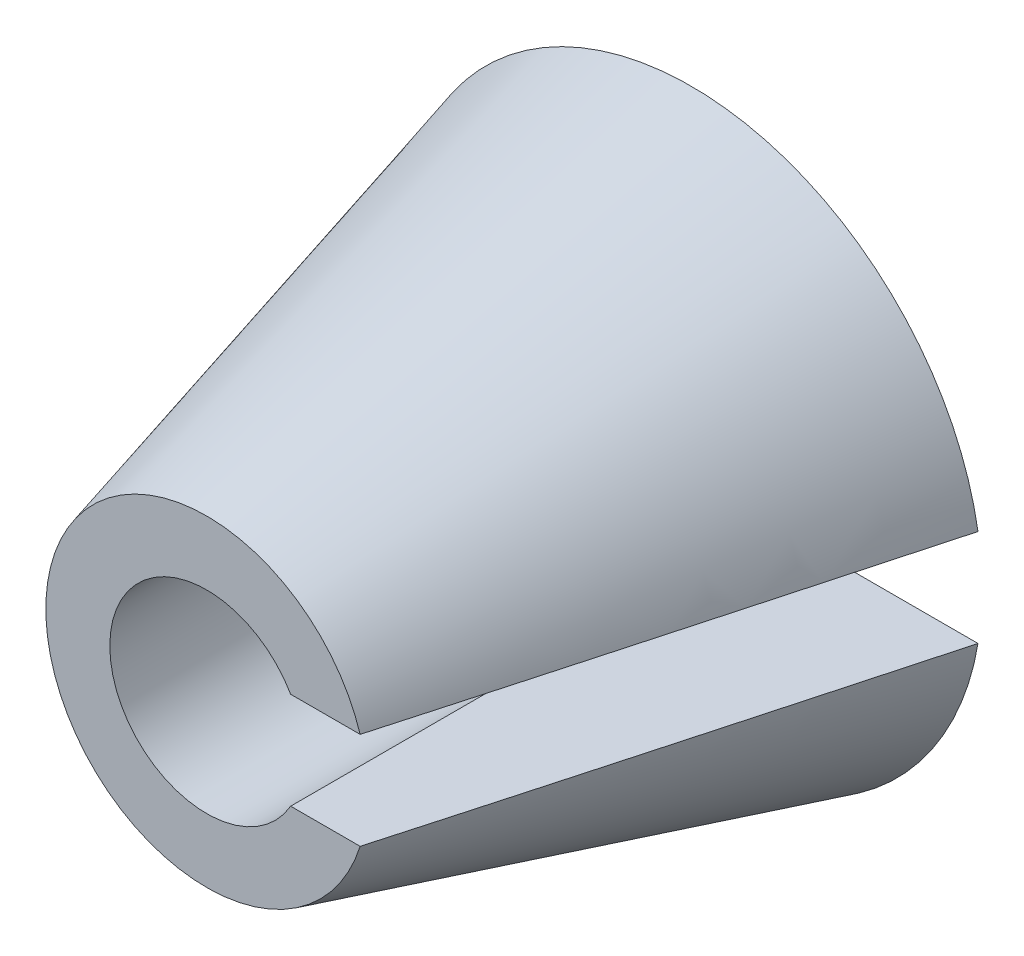
ISO-10303-21;
HEADER;
FILE_DESCRIPTION(('STEP AP214'),'2;1');
FILE_NAME('part.step','',(''),(''),'','','');
FILE_SCHEMA(('AUTOMOTIVE_DESIGN { 1 0 10303 214 1 1 1 1 }'));
ENDSEC;
DATA;
#1=APPLICATION_CONTEXT('core data for automotive mechanical design processes');
#2=APPLICATION_PROTOCOL_DEFINITION('international standard','automotive_design',2000,#1);
#3=PRODUCT_CONTEXT('',#1,'mechanical');
#4=PRODUCT('Part','Part','',(#3));
#5=PRODUCT_RELATED_PRODUCT_CATEGORY('part','',(#4));
#6=PRODUCT_DEFINITION_FORMATION('','',#4);
#7=PRODUCT_DEFINITION_CONTEXT('part definition',#1,'design');
#8=PRODUCT_DEFINITION('design','',#6,#7);
#9=PRODUCT_DEFINITION_SHAPE('','',#8);
#10=(LENGTH_UNIT() NAMED_UNIT(*) SI_UNIT(.MILLI.,.METRE.));
#11=(NAMED_UNIT(*) PLANE_ANGLE_UNIT() SI_UNIT($,.RADIAN.));
#12=(NAMED_UNIT(*) SI_UNIT($,.STERADIAN.) SOLID_ANGLE_UNIT());
#13=UNCERTAINTY_MEASURE_WITH_UNIT(LENGTH_MEASURE(1.E-05),#10,'distance_accuracy_value','');
#14=(GEOMETRIC_REPRESENTATION_CONTEXT(3) GLOBAL_UNCERTAINTY_ASSIGNED_CONTEXT((#13)) GLOBAL_UNIT_ASSIGNED_CONTEXT((#10,
#11,#12)) REPRESENTATION_CONTEXT('',''));
#15=CARTESIAN_POINT('',(0.,0.,0.));
#16=DIRECTION('',(0.,0.,1.));
#17=DIRECTION('',(1.,0.,0.));
#18=AXIS2_PLACEMENT_3D('',#15,#16,#17);
#19=CARTESIAN_POINT('',(0.,0.,0.));
#20=DIRECTION('',(0.,0.,-1.));
#21=DIRECTION('',(1.,0.,0.));
#22=AXIS2_PLACEMENT_3D('',#19,#20,#21);
#23=CONICAL_SURFACE('',#22,6.,0.26179938779915);
#24=CARTESIAN_POINT('',(0.,0.,0.));
#25=DIRECTION('',(0.,0.,1.));
#26=DIRECTION('',(1.,0.,0.));
#27=AXIS2_PLACEMENT_3D('',#24,#25,#26);
#28=CIRCLE('',#27,6.);
#29=CARTESIAN_POINT('',(5.91607978309962,1.,0.));
#30=VERTEX_POINT('',#29);
#31=CARTESIAN_POINT('',(5.91607978309962,-1.,0.));
#32=VERTEX_POINT('',#31);
#33=EDGE_CURVE('E53',#30,#32,#28,.T.);
#34=ORIENTED_EDGE('',*,*,#33,.T.);
#35=CARTESIAN_POINT('',(7.86764606829933,-1.,-7.20637686178306));
#36=CARTESIAN_POINT('',(7.67358093257711,-1.,-6.48791083582461));
#37=CARTESIAN_POINT('',(7.47941639547781,-1.,-5.76947163006494));
#38=CARTESIAN_POINT('',(7.09081762951427,-1.,-4.33266595765343));
#39=CARTESIAN_POINT('',(6.89638340057781,-1.,-3.61429949102113));
#40=CARTESIAN_POINT('',(6.50715802870426,-1.,-2.17759810812691));
#41=CARTESIAN_POINT('',(6.31236685700782,-1.,-1.45926319965485));
#42=CARTESIAN_POINT('',(5.92233632049141,-1.,-0.0227151247883951));
#43=CARTESIAN_POINT('',(5.72709695572005,-1.,0.695498041619203));
#44=CARTESIAN_POINT('',(5.33601456692654,-1.,2.1317577858784));
#45=CARTESIAN_POINT('',(5.14017154468255,-1.,2.84980436421403));
#46=CARTESIAN_POINT('',(4.74764366484651,-1.,4.28566487028006));
#47=CARTESIAN_POINT('',(4.55095881014779,-1.,5.00347879880097));
#48=CARTESIAN_POINT('',(4.15637387698971,-1.,6.43872026453747));
#49=CARTESIAN_POINT('',(3.95847388216664,-1.,7.1561478247298));
#50=CARTESIAN_POINT('',(3.56078842273446,-1.,8.59049100513599));
#51=CARTESIAN_POINT('',(3.36100293406612,-1.,9.30740661869142));
#52=CARTESIAN_POINT('',(3.01468771049255,-1.,10.5396341877083));
#53=CARTESIAN_POINT('',(2.8689182520442,-1.,11.0551593036322));
#54=CARTESIAN_POINT('',(2.64833036507019,-1.,11.8278851288014));
#55=CARTESIAN_POINT('',(2.57448014712804,-1.,12.0853620839691));
#56=CARTESIAN_POINT('',(2.42594190552158,-1.,12.6000764672381));
#57=CARTESIAN_POINT('',(2.35125387603948,-1.,12.8573138936627));
#58=CARTESIAN_POINT('',(2.20076526105176,-1.,13.3715038189127));
#59=CARTESIAN_POINT('',(2.12496451621292,-1.,13.6284562711525));
#60=CARTESIAN_POINT('',(1.97186908296628,-1.,14.1419120253778));
#61=CARTESIAN_POINT('',(1.89457442305106,-1.,14.3984153358279));
#62=CARTESIAN_POINT('',(1.77702758152167,-1.,14.7826969356929));
#63=CARTESIAN_POINT('',(1.73757533080256,-1.,14.9107198279955));
#64=CARTESIAN_POINT('',(1.65801556674422,-1.,15.1665611090953));
#65=CARTESIAN_POINT('',(1.61790805773787,-1.,15.2943794992387));
#66=CARTESIAN_POINT('',(1.53688635332859,-1.,15.5497700817268));
#67=CARTESIAN_POINT('',(1.49597210649291,-1.,15.6773422578014));
#68=CARTESIAN_POINT('',(1.41310771731348,-1.,15.9321525965593));
#69=CARTESIAN_POINT('',(1.37115755139541,-1.,16.0593907515683));
#70=CARTESIAN_POINT('',(1.328574501345,-1.,16.1864191795279));
#71=B_SPLINE_CURVE_WITH_KNOTS('',3,(#35,#36,#37,#38,#39,#40,#41,#42,#43,#44,#45,#46,#47,#48,#49,
#50,#51,#52,#53,#54,#55,#56,#57,#58,#59,#60,#61,#62,#63,#64,#65,#66,#67,#68,#69,#70),
.UNSPECIFIED.,.F.,.F.,(4,2,2,2,2,2,2,2,2,2,2,2,2,2,2,2,2,4),(0.,2.23264249788737,
4.46528559390912,6.69811726857511,8.93094870103296,11.1637735626191,13.3965907562199,
15.6292559535571,17.8619496787128,19.4691577917994,20.2727326145734,21.0763130208558,
21.8800096390667,22.6836909439268,23.0855814165112,23.4874692326833,23.889382754182,
24.2913054304328),.UNSPECIFIED.);
#72=CARTESIAN_POINT('',(3.16635024605844,-1.,10.));
#73=VERTEX_POINT('',#72);
#74=EDGE_CURVE('E105',#32,#73,#71,.T.);
#75=ORIENTED_EDGE('',*,*,#74,.T.);
#76=CARTESIAN_POINT('',(0.,0.,10.));
#77=DIRECTION('',(0.,0.,1.));
#78=DIRECTION('',(1.,0.,0.));
#79=AXIS2_PLACEMENT_3D('',#76,#77,#78);
#80=CIRCLE('',#79,3.32050807568877);
#81=CARTESIAN_POINT('',(3.16635024605844,1.,10.));
#82=VERTEX_POINT('',#81);
#83=EDGE_CURVE('E13',#82,#73,#80,.T.);
#84=ORIENTED_EDGE('',*,*,#83,.F.);
#85=CARTESIAN_POINT('',(7.86764606829933,1.,-7.20637686178306));
#86=CARTESIAN_POINT('',(7.67358093257711,1.,-6.48791083582461));
#87=CARTESIAN_POINT('',(7.47941639547781,1.,-5.76947163006494));
#88=CARTESIAN_POINT('',(7.09081762951427,1.,-4.33266595765343));
#89=CARTESIAN_POINT('',(6.89638340057781,1.,-3.61429949102113));
#90=CARTESIAN_POINT('',(6.50715802870426,1.,-2.17759810812691));
#91=CARTESIAN_POINT('',(6.31236685700782,1.,-1.45926319965485));
#92=CARTESIAN_POINT('',(5.92233632049141,1.,-0.0227151247883951));
#93=CARTESIAN_POINT('',(5.72709695572005,1.,0.695498041619203));
#94=CARTESIAN_POINT('',(5.33601456692654,1.,2.1317577858784));
#95=CARTESIAN_POINT('',(5.14017154468255,1.,2.84980436421403));
#96=CARTESIAN_POINT('',(4.74764366484651,1.,4.28566487028006));
#97=CARTESIAN_POINT('',(4.55095881014779,1.,5.00347879880097));
#98=CARTESIAN_POINT('',(4.15637387698971,1.,6.43872026453747));
#99=CARTESIAN_POINT('',(3.95847388216664,1.,7.1561478247298));
#100=CARTESIAN_POINT('',(3.56078842273446,1.,8.59049100513599));
#101=CARTESIAN_POINT('',(3.36100293406612,1.,9.30740661869142));
#102=CARTESIAN_POINT('',(3.01468771049255,1.,10.5396341877083));
#103=CARTESIAN_POINT('',(2.8689182520442,1.,11.0551593036322));
#104=CARTESIAN_POINT('',(2.64833036507019,1.,11.8278851288014));
#105=CARTESIAN_POINT('',(2.57448014712804,1.,12.0853620839691));
#106=CARTESIAN_POINT('',(2.42594190552158,1.,12.6000764672381));
#107=CARTESIAN_POINT('',(2.35125387603948,1.,12.8573138936627));
#108=CARTESIAN_POINT('',(2.20076526105176,1.,13.3715038189127));
#109=CARTESIAN_POINT('',(2.12496451621292,1.,13.6284562711525));
#110=CARTESIAN_POINT('',(1.97186908296628,1.,14.1419120253778));
#111=CARTESIAN_POINT('',(1.89457442305106,1.,14.3984153358279));
#112=CARTESIAN_POINT('',(1.77702758152167,1.,14.7826969356929));
#113=CARTESIAN_POINT('',(1.73757533080256,1.,14.9107198279955));
#114=CARTESIAN_POINT('',(1.65801556674422,1.,15.1665611090953));
#115=CARTESIAN_POINT('',(1.61790805773787,1.,15.2943794992387));
#116=CARTESIAN_POINT('',(1.53688635332859,1.,15.5497700817268));
#117=CARTESIAN_POINT('',(1.49597210649291,1.,15.6773422578014));
#118=CARTESIAN_POINT('',(1.41310771731348,1.,15.9321525965593));
#119=CARTESIAN_POINT('',(1.37115755139541,1.,16.0593907515683));
#120=CARTESIAN_POINT('',(1.328574501345,1.,16.1864191795279));
#121=B_SPLINE_CURVE_WITH_KNOTS('',3,(#85,#86,#87,#88,#89,#90,#91,#92,#93,#94,#95,#96,#97,#98,
#99,#100,#101,#102,#103,#104,#105,#106,#107,#108,#109,#110,#111,#112,#113,#114,#115,#116,#117,
#118,#119,#120),.UNSPECIFIED.,.F.,.F.,(4,2,2,2,2,2,2,2,2,2,2,2,2,2,2,2,2,4),(0.,
2.23264249788737,4.46528559390912,6.69811726857511,8.93094870103296,11.1637735626191,
13.3965907562199,15.6292559535571,17.8619496787128,19.4691577917994,20.2727326145734,
21.0763130208558,21.8800096390667,22.6836909439268,23.0855814165112,23.4874692326833,
23.889382754182,24.2913054304328),.UNSPECIFIED.);
#122=EDGE_CURVE('E92',#82,#30,#121,.F.);
#123=ORIENTED_EDGE('',*,*,#122,.T.);
#124=EDGE_LOOP('',(#34,#75,#84,#123));
#125=FACE_BOUND('',#124,.T.);
#126=ADVANCED_FACE('F45',(#125),#23,.T.);
#127=CARTESIAN_POINT('',(0.,0.,10.));
#128=DIRECTION('',(0.,0.,1.));
#129=DIRECTION('',(1.,0.,0.));
#130=AXIS2_PLACEMENT_3D('',#127,#128,#129);
#131=PLANE('',#130);
#132=DIRECTION('',(-1.,0.,0.));
#133=VECTOR('',#132,1.);
#134=CARTESIAN_POINT('',(1.73205080756888,-1.,10.));
#135=LINE('',#134,#133);
#136=CARTESIAN_POINT('',(1.73205080756888,-1.,10.));
#137=VERTEX_POINT('',#136);
#138=EDGE_CURVE('E86',#73,#137,#135,.T.);
#139=ORIENTED_EDGE('',*,*,#138,.T.);
#140=CARTESIAN_POINT('',(0.,0.,10.));
#141=DIRECTION('',(0.,0.,-1.));
#142=DIRECTION('',(-1.,0.,0.));
#143=AXIS2_PLACEMENT_3D('',#140,#141,#142);
#144=CIRCLE('',#143,2.);
#145=CARTESIAN_POINT('',(1.73205080756888,1.,10.));
#146=VERTEX_POINT('',#145);
#147=EDGE_CURVE('E98',#137,#146,#144,.T.);
#148=ORIENTED_EDGE('',*,*,#147,.T.);
#149=DIRECTION('',(1.,0.,0.));
#150=VECTOR('',#149,1.);
#151=CARTESIAN_POINT('',(1.73205080756888,1.,10.));
#152=LINE('',#151,#150);
#153=EDGE_CURVE('E68',#146,#82,#152,.T.);
#154=ORIENTED_EDGE('',*,*,#153,.T.);
#155=ORIENTED_EDGE('',*,*,#83,.T.);
#156=EDGE_LOOP('',(#139,#148,#154,#155));
#157=FACE_BOUND('',#156,.T.);
#158=ADVANCED_FACE('F97',(#157),#131,.T.);
#159=CARTESIAN_POINT('',(0.,0.,0.));
#160=DIRECTION('',(0.,0.,1.));
#161=DIRECTION('',(1.,0.,0.));
#162=AXIS2_PLACEMENT_3D('',#159,#160,#161);
#163=PLANE('',#162);
#164=CARTESIAN_POINT('',(0.,0.,0.));
#165=DIRECTION('',(0.,0.,-1.));
#166=DIRECTION('',(-1.,0.,0.));
#167=AXIS2_PLACEMENT_3D('',#164,#165,#166);
#168=CIRCLE('',#167,2.);
#169=CARTESIAN_POINT('',(1.73205080756888,-1.,0.));
#170=VERTEX_POINT('',#169);
#171=CARTESIAN_POINT('',(1.73205080756888,1.,0.));
#172=VERTEX_POINT('',#171);
#173=EDGE_CURVE('E102',#170,#172,#168,.T.);
#174=ORIENTED_EDGE('',*,*,#173,.F.);
#175=DIRECTION('',(-1.,0.,0.));
#176=VECTOR('',#175,1.);
#177=CARTESIAN_POINT('',(1.73205080756888,-1.,0.));
#178=LINE('',#177,#176);
#179=EDGE_CURVE('E60',#32,#170,#178,.T.);
#180=ORIENTED_EDGE('',*,*,#179,.F.);
#181=ORIENTED_EDGE('',*,*,#33,.F.);
#182=DIRECTION('',(1.,0.,0.));
#183=VECTOR('',#182,1.);
#184=CARTESIAN_POINT('',(1.73205080756888,1.,0.));
#185=LINE('',#184,#183);
#186=EDGE_CURVE('E139',#172,#30,#185,.T.);
#187=ORIENTED_EDGE('',*,*,#186,.F.);
#188=EDGE_LOOP('',(#174,#180,#181,#187));
#189=FACE_BOUND('',#188,.T.);
#190=ADVANCED_FACE('F126',(#189),#163,.F.);
#191=CARTESIAN_POINT('',(0.,0.,10.));
#192=DIRECTION('',(0.,0.,-1.));
#193=DIRECTION('',(-1.,0.,0.));
#194=AXIS2_PLACEMENT_3D('',#191,#192,#193);
#195=CYLINDRICAL_SURFACE('',#194,2.);
#196=ORIENTED_EDGE('',*,*,#147,.F.);
#197=DIRECTION('',(0.,0.,-1.));
#198=VECTOR('',#197,1.);
#199=CARTESIAN_POINT('',(1.73205080756888,-1.,10.));
#200=LINE('',#199,#198);
#201=EDGE_CURVE('E83',#137,#170,#200,.T.);
#202=ORIENTED_EDGE('',*,*,#201,.T.);
#203=ORIENTED_EDGE('',*,*,#173,.T.);
#204=DIRECTION('',(0.,0.,-1.));
#205=VECTOR('',#204,1.);
#206=CARTESIAN_POINT('',(1.73205080756888,1.,10.));
#207=LINE('',#206,#205);
#208=EDGE_CURVE('E93',#146,#172,#207,.T.);
#209=ORIENTED_EDGE('',*,*,#208,.F.);
#210=EDGE_LOOP('',(#196,#202,#203,#209));
#211=FACE_BOUND('',#210,.T.);
#212=ADVANCED_FACE('F101',(#211),#195,.F.);
#213=CARTESIAN_POINT('',(1.73205080756888,1.,10.));
#214=DIRECTION('',(0.,1.,0.));
#215=DIRECTION('',(-1.,0.,0.));
#216=AXIS2_PLACEMENT_3D('',#213,#214,#215);
#217=PLANE('',#216);
#218=ORIENTED_EDGE('',*,*,#153,.F.);
#219=ORIENTED_EDGE('',*,*,#208,.T.);
#220=ORIENTED_EDGE('',*,*,#186,.T.);
#221=ORIENTED_EDGE('',*,*,#122,.F.);
#222=EDGE_LOOP('',(#218,#219,#220,#221));
#223=FACE_BOUND('',#222,.T.);
#224=ADVANCED_FACE('F120',(#223),#217,.F.);
#225=CARTESIAN_POINT('',(1.73205080756888,-1.,10.));
#226=DIRECTION('',(0.,-1.,0.));
#227=DIRECTION('',(1.,0.,0.));
#228=AXIS2_PLACEMENT_3D('',#225,#226,#227);
#229=PLANE('',#228);
#230=ORIENTED_EDGE('',*,*,#179,.T.);
#231=ORIENTED_EDGE('',*,*,#201,.F.);
#232=ORIENTED_EDGE('',*,*,#138,.F.);
#233=ORIENTED_EDGE('',*,*,#74,.F.);
#234=EDGE_LOOP('',(#230,#231,#232,#233));
#235=FACE_BOUND('',#234,.T.);
#236=ADVANCED_FACE('F85',(#235),#229,.F.);
#237=CLOSED_SHELL('',(#126,#158,#190,#212,#224,#236));
#238=MANIFOLD_SOLID_BREP('B2',#237);
#239=ADVANCED_BREP_SHAPE_REPRESENTATION('',(#18,#238),#14);
#240=SHAPE_DEFINITION_REPRESENTATION(#9,#239);
ENDSEC;
END-ISO-10303-21;
